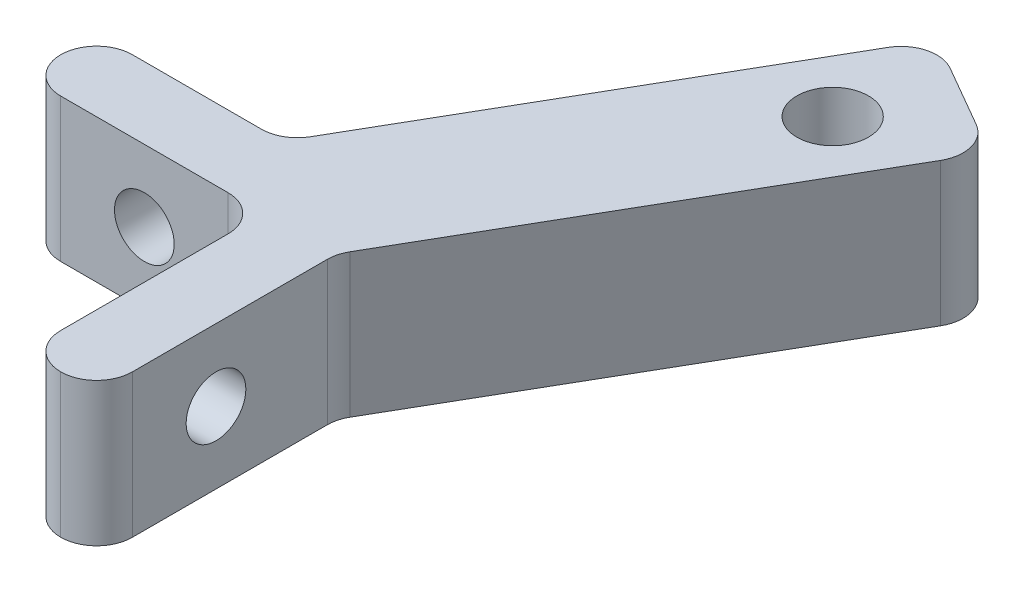
ISO-10303-21;
HEADER;
FILE_DESCRIPTION(('STEP AP214'),'2;1');
FILE_NAME('part.step','',(''),(''),'','','');
FILE_SCHEMA(('AUTOMOTIVE_DESIGN { 1 0 10303 214 1 1 1 1 }'));
ENDSEC;
DATA;
#1=APPLICATION_CONTEXT('core data for automotive mechanical design processes');
#2=APPLICATION_PROTOCOL_DEFINITION('international standard','automotive_design',2000,#1);
#3=PRODUCT_CONTEXT('',#1,'mechanical');
#4=PRODUCT('Part','Part','',(#3));
#5=PRODUCT_RELATED_PRODUCT_CATEGORY('part','',(#4));
#6=PRODUCT_DEFINITION_FORMATION('','',#4);
#7=PRODUCT_DEFINITION_CONTEXT('part definition',#1,'design');
#8=PRODUCT_DEFINITION('design','',#6,#7);
#9=PRODUCT_DEFINITION_SHAPE('','',#8);
#10=(LENGTH_UNIT() NAMED_UNIT(*) SI_UNIT(.MILLI.,.METRE.));
#11=(NAMED_UNIT(*) PLANE_ANGLE_UNIT() SI_UNIT($,.RADIAN.));
#12=(NAMED_UNIT(*) SI_UNIT($,.STERADIAN.) SOLID_ANGLE_UNIT());
#13=UNCERTAINTY_MEASURE_WITH_UNIT(LENGTH_MEASURE(1.E-05),#10,'distance_accuracy_value','');
#14=(GEOMETRIC_REPRESENTATION_CONTEXT(3) GLOBAL_UNCERTAINTY_ASSIGNED_CONTEXT((#13)) GLOBAL_UNIT_ASSIGNED_CONTEXT((#10,
#11,#12)) REPRESENTATION_CONTEXT('',''));
#15=CARTESIAN_POINT('',(0.,0.,0.));
#16=DIRECTION('',(0.,0.,1.));
#17=DIRECTION('',(1.,0.,0.));
#18=AXIS2_PLACEMENT_3D('',#15,#16,#17);
#19=CARTESIAN_POINT('',(20.0710721887332,-6.,-34.7641167932687));
#20=DIRECTION('',(-0.86602540378444,0.,-0.499999999999998));
#21=DIRECTION('',(-0.499999999999998,0.,0.86602540378444));
#22=AXIS2_PLACEMENT_3D('',#19,#20,#21);
#23=PLANE('',#22);
#24=DIRECTION('',(-0.500000000000004,0.,0.866025403784436));
#25=VECTOR('',#24,1.);
#26=CARTESIAN_POINT('',(2.63202289441557,-6.,-4.55879737981221));
#27=LINE('',#26,#25);
#28=CARTESIAN_POINT('',(18.5710721887335,-6.,-32.1660405819153));
#29=VERTEX_POINT('',#28);
#30=CARTESIAN_POINT('',(0.866025403784463,-6.,-1.50000000000003));
#31=VERTEX_POINT('',#30);
#32=EDGE_CURVE('E295',#29,#31,#27,.T.);
#33=ORIENTED_EDGE('',*,*,#32,.T.);
#34=DIRECTION('',(0.,1.,0.));
#35=VECTOR('',#34,1.);
#36=CARTESIAN_POINT('',(0.866025403784489,6.,-1.50000000000001));
#37=LINE('',#36,#35);
#38=CARTESIAN_POINT('',(0.866025403784463,6.,-1.50000000000003));
#39=VERTEX_POINT('',#38);
#40=EDGE_CURVE('E182',#31,#39,#37,.T.);
#41=ORIENTED_EDGE('',*,*,#40,.T.);
#42=DIRECTION('',(-0.500000000000004,0.,0.866025403784436));
#43=VECTOR('',#42,1.);
#44=CARTESIAN_POINT('',(2.63202289441557,6.,-4.55879737981221));
#45=LINE('',#44,#43);
#46=CARTESIAN_POINT('',(18.5710721887335,6.,-32.1660405819153));
#47=VERTEX_POINT('',#46);
#48=EDGE_CURVE('E165',#47,#39,#45,.T.);
#49=ORIENTED_EDGE('',*,*,#48,.F.);
#50=DIRECTION('',(0.,1.,0.));
#51=VECTOR('',#50,1.);
#52=CARTESIAN_POINT('',(18.5710721887333,-6.,-32.1660405819155));
#53=LINE('',#52,#51);
#54=EDGE_CURVE('E179',#47,#29,#53,.F.);
#55=ORIENTED_EDGE('',*,*,#54,.T.);
#56=EDGE_LOOP('',(#33,#41,#49,#55));
#57=FACE_BOUND('',#56,.T.);
#58=ADVANCED_FACE('F38',(#57),#23,.T.);
#59=CARTESIAN_POINT('',(30.4633770341466,-6.,-28.7641167932689));
#60=DIRECTION('',(0.499999999999984,0.,-0.866025403784448));
#61=DIRECTION('',(-0.866025403784448,0.,-0.499999999999984));
#62=AXIS2_PLACEMENT_3D('',#59,#60,#61);
#63=PLANE('',#62);
#64=DIRECTION('',(-0.866025403784448,0.,-0.499999999999984));
#65=VECTOR('',#64,1.);
#66=CARTESIAN_POINT('',(30.4633770341466,6.,-28.7641167932689));
#67=LINE('',#66,#65);
#68=CARTESIAN_POINT('',(27.8653008227932,6.,-30.2641167932689));
#69=VERTEX_POINT('',#68);
#70=CARTESIAN_POINT('',(22.6691484000865,6.,-33.2641167932688));
#71=VERTEX_POINT('',#70);
#72=EDGE_CURVE('E167',#69,#71,#67,.T.);
#73=ORIENTED_EDGE('',*,*,#72,.F.);
#74=DIRECTION('',(0.,1.,0.));
#75=VECTOR('',#74,1.);
#76=CARTESIAN_POINT('',(27.8653008227932,-6.,-30.2641167932689));
#77=LINE('',#76,#75);
#78=CARTESIAN_POINT('',(27.8653008227932,-6.,-30.2641167932689));
#79=VERTEX_POINT('',#78);
#80=EDGE_CURVE('E253',#69,#79,#77,.F.);
#81=ORIENTED_EDGE('',*,*,#80,.T.);
#82=DIRECTION('',(-0.866025403784448,0.,-0.499999999999984));
#83=VECTOR('',#82,1.);
#84=CARTESIAN_POINT('',(30.4633770341466,-6.,-28.7641167932689));
#85=LINE('',#84,#83);
#86=CARTESIAN_POINT('',(22.6691484000865,-6.,-33.2641167932688));
#87=VERTEX_POINT('',#86);
#88=EDGE_CURVE('E190',#79,#87,#85,.T.);
#89=ORIENTED_EDGE('',*,*,#88,.T.);
#90=DIRECTION('',(0.,1.,0.));
#91=VECTOR('',#90,1.);
#92=CARTESIAN_POINT('',(22.6691484000865,-6.,-33.2641167932688));
#93=LINE('',#92,#91);
#94=EDGE_CURVE('E251',#87,#71,#93,.T.);
#95=ORIENTED_EDGE('',*,*,#94,.T.);
#96=EDGE_LOOP('',(#73,#81,#89,#95));
#97=FACE_BOUND('',#96,.T.);
#98=ADVANCED_FACE('F324',(#97),#63,.T.);
#99=CARTESIAN_POINT('',(10.463377034147,-6.,5.87689935810887));
#100=DIRECTION('',(0.866025403784445,0.,0.499999999999989));
#101=DIRECTION('',(0.499999999999989,0.,-0.866025403784445));
#102=AXIS2_PLACEMENT_3D('',#99,#100,#101);
#103=PLANE('',#102);
#104=DIRECTION('',(0.499999999999989,0.,-0.866025403784445));
#105=VECTOR('',#104,1.);
#106=CARTESIAN_POINT('',(10.463377034147,6.,5.87689935810887));
#107=LINE('',#106,#105);
#108=CARTESIAN_POINT('',(10.8653008227937,6.,5.18074693540225));
#109=VERTEX_POINT('',#108);
#110=CARTESIAN_POINT('',(28.9633770341466,6.,-26.1660405819156));
#111=VERTEX_POINT('',#110);
#112=EDGE_CURVE('E322',#109,#111,#107,.T.);
#113=ORIENTED_EDGE('',*,*,#112,.F.);
#114=DIRECTION('',(0.,1.,0.));
#115=VECTOR('',#114,1.);
#116=CARTESIAN_POINT('',(10.8653008227937,-6.,5.18074693540225));
#117=LINE('',#116,#115);
#118=CARTESIAN_POINT('',(10.8653008227937,-6.,5.18074693540225));
#119=VERTEX_POINT('',#118);
#120=EDGE_CURVE('E249',#109,#119,#117,.F.);
#121=ORIENTED_EDGE('',*,*,#120,.T.);
#122=DIRECTION('',(0.499999999999989,0.,-0.866025403784445));
#123=VECTOR('',#122,1.);
#124=CARTESIAN_POINT('',(10.463377034147,-6.,5.87689935810887));
#125=LINE('',#124,#123);
#126=CARTESIAN_POINT('',(28.9633770341466,-6.,-26.1660405819156));
#127=VERTEX_POINT('',#126);
#128=EDGE_CURVE('E197',#119,#127,#125,.T.);
#129=ORIENTED_EDGE('',*,*,#128,.T.);
#130=DIRECTION('',(0.,1.,0.));
#131=VECTOR('',#130,1.);
#132=CARTESIAN_POINT('',(28.9633770341466,-6.,-26.1660405819156));
#133=LINE('',#132,#131);
#134=EDGE_CURVE('E245',#127,#111,#133,.T.);
#135=ORIENTED_EDGE('',*,*,#134,.T.);
#136=EDGE_LOOP('',(#113,#121,#129,#135));
#137=FACE_BOUND('',#136,.T.);
#138=ADVANCED_FACE('F314',(#137),#103,.T.);
#139=CARTESIAN_POINT('',(10.463377034147,-6.,26.));
#140=DIRECTION('',(1.,0.,0.));
#141=DIRECTION('',(0.,0.,-1.));
#142=AXIS2_PLACEMENT_3D('',#139,#140,#141);
#143=PLANE('',#142);
#144=CARTESIAN_POINT('',(10.463377034147,0.,16.));
#145=DIRECTION('',(1.,0.,0.));
#146=DIRECTION('',(0.,0.,-1.));
#147=AXIS2_PLACEMENT_3D('',#144,#145,#146);
#148=CIRCLE('',#147,2.5);
#149=CARTESIAN_POINT('',(10.463377034147,0.,13.5));
#150=VERTEX_POINT('',#149);
#151=EDGE_CURVE('E347',#150,#150,#148,.T.);
#152=ORIENTED_EDGE('',*,*,#151,.F.);
#153=EDGE_LOOP('',(#152));
#154=FACE_BOUND('',#153,.T.);
#155=DIRECTION('',(0.,0.,-1.));
#156=VECTOR('',#155,1.);
#157=CARTESIAN_POINT('',(10.463377034147,6.,26.));
#158=LINE('',#157,#156);
#159=CARTESIAN_POINT('',(10.463377034147,6.,23.));
#160=VERTEX_POINT('',#159);
#161=CARTESIAN_POINT('',(10.463377034147,6.,6.68074693540221));
#162=VERTEX_POINT('',#161);
#163=EDGE_CURVE('E331',#160,#162,#158,.T.);
#164=ORIENTED_EDGE('',*,*,#163,.F.);
#165=DIRECTION('',(0.,1.,0.));
#166=VECTOR('',#165,1.);
#167=CARTESIAN_POINT('',(10.463377034147,-6.,23.));
#168=LINE('',#167,#166);
#169=CARTESIAN_POINT('',(10.463377034147,-6.,23.));
#170=VERTEX_POINT('',#169);
#171=EDGE_CURVE('E219',#160,#170,#168,.F.);
#172=ORIENTED_EDGE('',*,*,#171,.T.);
#173=DIRECTION('',(0.,0.,-1.));
#174=VECTOR('',#173,1.);
#175=CARTESIAN_POINT('',(10.463377034147,-6.,26.));
#176=LINE('',#175,#174);
#177=CARTESIAN_POINT('',(10.463377034147,-6.,6.68074693540221));
#178=VERTEX_POINT('',#177);
#179=EDGE_CURVE('E305',#170,#178,#176,.T.);
#180=ORIENTED_EDGE('',*,*,#179,.T.);
#181=DIRECTION('',(0.,1.,0.));
#182=VECTOR('',#181,1.);
#183=CARTESIAN_POINT('',(10.463377034147,6.,6.68074693540221));
#184=LINE('',#183,#182);
#185=EDGE_CURVE('E216',#178,#162,#184,.T.);
#186=ORIENTED_EDGE('',*,*,#185,.T.);
#187=EDGE_LOOP('',(#164,#172,#180,#186));
#188=FACE_BOUND('',#187,.T.);
#189=ADVANCED_FACE('F384',(#154,#188),#143,.T.);
#190=CARTESIAN_POINT('',(4.46337703414703,-6.,6.));
#191=DIRECTION('',(-1.,0.,0.));
#192=DIRECTION('',(0.,0.,1.));
#193=AXIS2_PLACEMENT_3D('',#190,#191,#192);
#194=PLANE('',#193);
#195=CARTESIAN_POINT('',(4.46337703414703,0.,16.));
#196=DIRECTION('',(-1.,0.,0.));
#197=DIRECTION('',(0.,0.,1.));
#198=AXIS2_PLACEMENT_3D('',#195,#196,#197);
#199=CIRCLE('',#198,2.5);
#200=CARTESIAN_POINT('',(4.46337703414703,0.,18.5));
#201=VERTEX_POINT('',#200);
#202=EDGE_CURVE('E350',#201,#201,#199,.T.);
#203=ORIENTED_EDGE('',*,*,#202,.F.);
#204=EDGE_LOOP('',(#203));
#205=FACE_BOUND('',#204,.T.);
#206=DIRECTION('',(0.,0.,1.));
#207=VECTOR('',#206,1.);
#208=CARTESIAN_POINT('',(4.46337703414703,-6.,6.));
#209=LINE('',#208,#207);
#210=CARTESIAN_POINT('',(4.46337703414703,-6.,9.));
#211=VERTEX_POINT('',#210);
#212=CARTESIAN_POINT('',(4.46337703414703,-6.,23.));
#213=VERTEX_POINT('',#212);
#214=EDGE_CURVE('E297',#211,#213,#209,.T.);
#215=ORIENTED_EDGE('',*,*,#214,.T.);
#216=DIRECTION('',(0.,1.,0.));
#217=VECTOR('',#216,1.);
#218=CARTESIAN_POINT('',(4.46337703414703,-6.,23.));
#219=LINE('',#218,#217);
#220=CARTESIAN_POINT('',(4.46337703414703,6.,23.));
#221=VERTEX_POINT('',#220);
#222=EDGE_CURVE('E236',#213,#221,#219,.T.);
#223=ORIENTED_EDGE('',*,*,#222,.T.);
#224=DIRECTION('',(0.,0.,1.));
#225=VECTOR('',#224,1.);
#226=CARTESIAN_POINT('',(4.46337703414703,6.,6.));
#227=LINE('',#226,#225);
#228=CARTESIAN_POINT('',(4.46337703414703,6.,9.));
#229=VERTEX_POINT('',#228);
#230=EDGE_CURVE('E336',#229,#221,#227,.T.);
#231=ORIENTED_EDGE('',*,*,#230,.F.);
#232=DIRECTION('',(0.,1.,0.));
#233=VECTOR('',#232,1.);
#234=CARTESIAN_POINT('',(4.46337703414703,-6.,9.));
#235=LINE('',#234,#233);
#236=EDGE_CURVE('E234',#229,#211,#235,.F.);
#237=ORIENTED_EDGE('',*,*,#236,.T.);
#238=EDGE_LOOP('',(#215,#223,#231,#237));
#239=FACE_BOUND('',#238,.T.);
#240=ADVANCED_FACE('F370',(#205,#239),#194,.T.);
#241=CARTESIAN_POINT('',(-15.536622965853,-6.,6.));
#242=DIRECTION('',(0.,0.,1.));
#243=DIRECTION('',(1.,0.,0.));
#244=AXIS2_PLACEMENT_3D('',#241,#242,#243);
#245=PLANE('',#244);
#246=CARTESIAN_POINT('',(-5.53662296585297,0.,6.));
#247=DIRECTION('',(0.,0.,1.));
#248=DIRECTION('',(1.,0.,0.));
#249=AXIS2_PLACEMENT_3D('',#246,#247,#248);
#250=CIRCLE('',#249,2.5);
#251=CARTESIAN_POINT('',(-3.03662296585297,0.,6.));
#252=VERTEX_POINT('',#251);
#253=EDGE_CURVE('E266',#252,#252,#250,.T.);
#254=ORIENTED_EDGE('',*,*,#253,.F.);
#255=EDGE_LOOP('',(#254));
#256=FACE_BOUND('',#255,.T.);
#257=DIRECTION('',(1.,0.,0.));
#258=VECTOR('',#257,1.);
#259=CARTESIAN_POINT('',(-15.536622965853,6.,6.));
#260=LINE('',#259,#258);
#261=CARTESIAN_POINT('',(-12.536622965853,6.,6.));
#262=VERTEX_POINT('',#261);
#263=CARTESIAN_POINT('',(1.46337703414703,6.,6.));
#264=VERTEX_POINT('',#263);
#265=EDGE_CURVE('E340',#262,#264,#260,.T.);
#266=ORIENTED_EDGE('',*,*,#265,.F.);
#267=DIRECTION('',(0.,1.,0.));
#268=VECTOR('',#267,1.);
#269=CARTESIAN_POINT('',(-12.536622965853,-6.,6.));
#270=LINE('',#269,#268);
#271=CARTESIAN_POINT('',(-12.536622965853,-6.,6.));
#272=VERTEX_POINT('',#271);
#273=EDGE_CURVE('E242',#262,#272,#270,.F.);
#274=ORIENTED_EDGE('',*,*,#273,.T.);
#275=DIRECTION('',(1.,0.,0.));
#276=VECTOR('',#275,1.);
#277=CARTESIAN_POINT('',(-15.536622965853,-6.,6.));
#278=LINE('',#277,#276);
#279=CARTESIAN_POINT('',(1.46337703414703,-6.,6.));
#280=VERTEX_POINT('',#279);
#281=EDGE_CURVE('E294',#272,#280,#278,.T.);
#282=ORIENTED_EDGE('',*,*,#281,.T.);
#283=DIRECTION('',(0.,1.,0.));
#284=VECTOR('',#283,1.);
#285=CARTESIAN_POINT('',(1.46337703414703,6.,6.));
#286=LINE('',#285,#284);
#287=EDGE_CURVE('E239',#280,#264,#286,.T.);
#288=ORIENTED_EDGE('',*,*,#287,.T.);
#289=EDGE_LOOP('',(#266,#274,#282,#288));
#290=FACE_BOUND('',#289,.T.);
#291=ADVANCED_FACE('F361',(#256,#290),#245,.T.);
#292=CARTESIAN_POINT('',(0.,-6.,0.));
#293=DIRECTION('',(0.,0.,-1.));
#294=DIRECTION('',(-1.,0.,0.));
#295=AXIS2_PLACEMENT_3D('',#292,#293,#294);
#296=PLANE('',#295);
#297=CARTESIAN_POINT('',(-5.53662296585297,0.,0.));
#298=DIRECTION('',(0.,0.,-1.));
#299=DIRECTION('',(-1.,0.,0.));
#300=AXIS2_PLACEMENT_3D('',#297,#298,#299);
#301=CIRCLE('',#300,2.5);
#302=CARTESIAN_POINT('',(-8.03662296585297,0.,0.));
#303=VERTEX_POINT('',#302);
#304=EDGE_CURVE('E200',#303,#303,#301,.T.);
#305=ORIENTED_EDGE('',*,*,#304,.F.);
#306=EDGE_LOOP('',(#305));
#307=FACE_BOUND('',#306,.T.);
#308=DIRECTION('',(-1.,0.,0.));
#309=VECTOR('',#308,1.);
#310=CARTESIAN_POINT('',(0.,6.,0.));
#311=LINE('',#310,#309);
#312=CARTESIAN_POINT('',(-1.73205080756883,6.,0.));
#313=VERTEX_POINT('',#312);
#314=CARTESIAN_POINT('',(-12.536622965853,6.,0.));
#315=VERTEX_POINT('',#314);
#316=EDGE_CURVE('E184',#313,#315,#311,.T.);
#317=ORIENTED_EDGE('',*,*,#316,.F.);
#318=DIRECTION('',(0.,1.,0.));
#319=VECTOR('',#318,1.);
#320=CARTESIAN_POINT('',(-1.73205080756883,-6.,0.));
#321=LINE('',#320,#319);
#322=CARTESIAN_POINT('',(-1.73205080756883,-6.,0.));
#323=VERTEX_POINT('',#322);
#324=EDGE_CURVE('E174',#313,#323,#321,.F.);
#325=ORIENTED_EDGE('',*,*,#324,.T.);
#326=DIRECTION('',(-1.,0.,0.));
#327=VECTOR('',#326,1.);
#328=CARTESIAN_POINT('',(0.,-6.,0.));
#329=LINE('',#328,#327);
#330=CARTESIAN_POINT('',(-12.536622965853,-6.,0.));
#331=VERTEX_POINT('',#330);
#332=EDGE_CURVE('E287',#323,#331,#329,.T.);
#333=ORIENTED_EDGE('',*,*,#332,.T.);
#334=DIRECTION('',(0.,1.,0.));
#335=VECTOR('',#334,1.);
#336=CARTESIAN_POINT('',(-12.536622965853,-6.,0.));
#337=LINE('',#336,#335);
#338=EDGE_CURVE('E193',#331,#315,#337,.T.);
#339=ORIENTED_EDGE('',*,*,#338,.T.);
#340=EDGE_LOOP('',(#317,#325,#333,#339));
#341=FACE_BOUND('',#340,.T.);
#342=ADVANCED_FACE('F291',(#307,#341),#296,.T.);
#343=CARTESIAN_POINT('',(0.,-6.,0.));
#344=DIRECTION('',(0.,-1.,0.));
#345=DIRECTION('',(0.,0.,-1.));
#346=AXIS2_PLACEMENT_3D('',#343,#344,#345);
#347=PLANE('',#346);
#348=CARTESIAN_POINT('',(21.26722461144,-6.,-24.8359135629934));
#349=DIRECTION('',(0.,1.,0.));
#350=DIRECTION('',(0.,0.,1.));
#351=AXIS2_PLACEMENT_3D('',#348,#349,#350);
#352=CIRCLE('',#351,2.99999999999997);
#353=CARTESIAN_POINT('',(21.26722461144,-6.,-21.8359135629934));
#354=VERTEX_POINT('',#353);
#355=EDGE_CURVE('E299',#354,#354,#352,.T.);
#356=ORIENTED_EDGE('',*,*,#355,.T.);
#357=EDGE_LOOP('',(#356));
#358=FACE_BOUND('',#357,.T.);
#359=ORIENTED_EDGE('',*,*,#179,.F.);
#360=CARTESIAN_POINT('',(7.46337703414704,-6.,23.));
#361=DIRECTION('',(0.,-1.,0.));
#362=DIRECTION('',(0.,0.,-1.));
#363=AXIS2_PLACEMENT_3D('',#360,#361,#362);
#364=CIRCLE('',#363,3.);
#365=CARTESIAN_POINT('',(7.46337703414703,-6.,26.));
#366=VERTEX_POINT('',#365);
#367=EDGE_CURVE('E232',#170,#366,#364,.T.);
#368=ORIENTED_EDGE('',*,*,#367,.T.);
#369=CARTESIAN_POINT('',(7.46337703414703,-6.,23.));
#370=DIRECTION('',(0.,-1.,0.));
#371=DIRECTION('',(0.,0.,-1.));
#372=AXIS2_PLACEMENT_3D('',#369,#370,#371);
#373=CIRCLE('',#372,3.);
#374=EDGE_CURVE('E230',#366,#213,#373,.T.);
#375=ORIENTED_EDGE('',*,*,#374,.T.);
#376=ORIENTED_EDGE('',*,*,#214,.F.);
#377=CARTESIAN_POINT('',(1.46337703414703,-6.,9.));
#378=DIRECTION('',(0.,-1.,0.));
#379=DIRECTION('',(0.,0.,-1.));
#380=AXIS2_PLACEMENT_3D('',#377,#378,#379);
#381=CIRCLE('',#380,3.);
#382=EDGE_CURVE('E61',#211,#280,#381,.F.);
#383=ORIENTED_EDGE('',*,*,#382,.T.);
#384=ORIENTED_EDGE('',*,*,#281,.F.);
#385=CARTESIAN_POINT('',(-12.536622965853,-6.,3.));
#386=DIRECTION('',(0.,-1.,0.));
#387=DIRECTION('',(0.,0.,-1.));
#388=AXIS2_PLACEMENT_3D('',#385,#386,#387);
#389=CIRCLE('',#388,3.);
#390=CARTESIAN_POINT('',(-15.536622965853,-6.,3.));
#391=VERTEX_POINT('',#390);
#392=EDGE_CURVE('E55',#272,#391,#389,.T.);
#393=ORIENTED_EDGE('',*,*,#392,.T.);
#394=CARTESIAN_POINT('',(-12.536622965853,-6.,3.));
#395=DIRECTION('',(0.,-1.,0.));
#396=DIRECTION('',(0.,0.,-1.));
#397=AXIS2_PLACEMENT_3D('',#394,#395,#396);
#398=CIRCLE('',#397,3.);
#399=EDGE_CURVE('E227',#391,#331,#398,.T.);
#400=ORIENTED_EDGE('',*,*,#399,.T.);
#401=ORIENTED_EDGE('',*,*,#332,.F.);
#402=CARTESIAN_POINT('',(-1.73205080756883,-6.,-3.));
#403=DIRECTION('',(0.,-1.,0.));
#404=DIRECTION('',(0.,0.,-1.));
#405=AXIS2_PLACEMENT_3D('',#402,#403,#404);
#406=CIRCLE('',#405,3.);
#407=EDGE_CURVE('E258',#323,#31,#406,.F.);
#408=ORIENTED_EDGE('',*,*,#407,.T.);
#409=ORIENTED_EDGE('',*,*,#32,.F.);
#410=CARTESIAN_POINT('',(21.1691484000866,-6.,-30.6660405819155));
#411=DIRECTION('',(0.,-1.,0.));
#412=DIRECTION('',(0.,0.,-1.));
#413=AXIS2_PLACEMENT_3D('',#410,#411,#412);
#414=CIRCLE('',#413,3.);
#415=EDGE_CURVE('E188',#29,#87,#414,.T.);
#416=ORIENTED_EDGE('',*,*,#415,.T.);
#417=ORIENTED_EDGE('',*,*,#88,.F.);
#418=CARTESIAN_POINT('',(26.3653008227933,-6.,-27.6660405819156));
#419=DIRECTION('',(0.,-1.,0.));
#420=DIRECTION('',(0.,0.,-1.));
#421=AXIS2_PLACEMENT_3D('',#418,#419,#420);
#422=CIRCLE('',#421,3.);
#423=EDGE_CURVE('E224',#79,#127,#422,.T.);
#424=ORIENTED_EDGE('',*,*,#423,.T.);
#425=ORIENTED_EDGE('',*,*,#128,.F.);
#426=CARTESIAN_POINT('',(13.4633770341471,-6.,6.68074693540222));
#427=DIRECTION('',(0.,-1.,0.));
#428=DIRECTION('',(0.,0.,-1.));
#429=AXIS2_PLACEMENT_3D('',#426,#427,#428);
#430=CIRCLE('',#429,3.);
#431=EDGE_CURVE('E11',#119,#178,#430,.F.);
#432=ORIENTED_EDGE('',*,*,#431,.T.);
#433=EDGE_LOOP('',(#359,#368,#375,#376,#383,#384,#393,#400,#401,#408,#409,#416,#417,#424,#425,#432));
#434=FACE_BOUND('',#433,.T.);
#435=ADVANCED_FACE('F286',(#358,#434),#347,.T.);
#436=CARTESIAN_POINT('',(21.26722461144,-6.,-24.8359135629934));
#437=DIRECTION('',(0.,1.,0.));
#438=DIRECTION('',(0.,0.,1.));
#439=AXIS2_PLACEMENT_3D('',#436,#437,#438);
#440=CYLINDRICAL_SURFACE('',#439,2.99999999999997);
#441=ORIENTED_EDGE('',*,*,#355,.F.);
#442=EDGE_LOOP('',(#441));
#443=FACE_BOUND('',#442,.T.);
#444=CARTESIAN_POINT('',(21.26722461144,6.,-24.8359135629934));
#445=DIRECTION('',(0.,1.,0.));
#446=DIRECTION('',(0.,0.,1.));
#447=AXIS2_PLACEMENT_3D('',#444,#445,#446);
#448=CIRCLE('',#447,2.99999999999997);
#449=CARTESIAN_POINT('',(21.26722461144,6.,-21.8359135629934));
#450=VERTEX_POINT('',#449);
#451=EDGE_CURVE('E185',#450,#450,#448,.T.);
#452=ORIENTED_EDGE('',*,*,#451,.T.);
#453=EDGE_LOOP('',(#452));
#454=FACE_BOUND('',#453,.T.);
#455=ADVANCED_FACE('F367',(#443,#454),#440,.F.);
#456=CARTESIAN_POINT('',(0.,6.,0.));
#457=DIRECTION('',(0.,-1.,0.));
#458=DIRECTION('',(0.,0.,-1.));
#459=AXIS2_PLACEMENT_3D('',#456,#457,#458);
#460=PLANE('',#459);
#461=CARTESIAN_POINT('',(7.46337703414703,6.,23.));
#462=DIRECTION('',(0.,-1.,0.));
#463=DIRECTION('',(0.,0.,-1.));
#464=AXIS2_PLACEMENT_3D('',#461,#462,#463);
#465=CIRCLE('',#464,3.);
#466=CARTESIAN_POINT('',(7.46337703414703,6.,26.));
#467=VERTEX_POINT('',#466);
#468=EDGE_CURVE('E210',#221,#467,#465,.F.);
#469=ORIENTED_EDGE('',*,*,#468,.T.);
#470=CARTESIAN_POINT('',(7.46337703414704,6.,23.));
#471=DIRECTION('',(0.,-1.,0.));
#472=DIRECTION('',(0.,0.,-1.));
#473=AXIS2_PLACEMENT_3D('',#470,#471,#472);
#474=CIRCLE('',#473,3.);
#475=EDGE_CURVE('E213',#467,#160,#474,.F.);
#476=ORIENTED_EDGE('',*,*,#475,.T.);
#477=ORIENTED_EDGE('',*,*,#163,.T.);
#478=CARTESIAN_POINT('',(13.4633770341471,6.,6.68074693540222));
#479=DIRECTION('',(0.,-1.,0.));
#480=DIRECTION('',(0.,0.,-1.));
#481=AXIS2_PLACEMENT_3D('',#478,#479,#480);
#482=CIRCLE('',#481,3.);
#483=EDGE_CURVE('E47',#162,#109,#482,.T.);
#484=ORIENTED_EDGE('',*,*,#483,.T.);
#485=ORIENTED_EDGE('',*,*,#112,.T.);
#486=CARTESIAN_POINT('',(26.3653008227933,6.,-27.6660405819156));
#487=DIRECTION('',(0.,-1.,0.));
#488=DIRECTION('',(0.,0.,-1.));
#489=AXIS2_PLACEMENT_3D('',#486,#487,#488);
#490=CIRCLE('',#489,3.);
#491=EDGE_CURVE('E173',#111,#69,#490,.F.);
#492=ORIENTED_EDGE('',*,*,#491,.T.);
#493=ORIENTED_EDGE('',*,*,#72,.T.);
#494=CARTESIAN_POINT('',(21.1691484000866,6.,-30.6660405819155));
#495=DIRECTION('',(0.,-1.,0.));
#496=DIRECTION('',(0.,0.,-1.));
#497=AXIS2_PLACEMENT_3D('',#494,#495,#496);
#498=CIRCLE('',#497,3.);
#499=EDGE_CURVE('E161',#71,#47,#498,.F.);
#500=ORIENTED_EDGE('',*,*,#499,.T.);
#501=ORIENTED_EDGE('',*,*,#48,.T.);
#502=CARTESIAN_POINT('',(-1.73205080756883,6.,-3.));
#503=DIRECTION('',(0.,-1.,0.));
#504=DIRECTION('',(0.,0.,-1.));
#505=AXIS2_PLACEMENT_3D('',#502,#503,#504);
#506=CIRCLE('',#505,3.);
#507=EDGE_CURVE('E256',#39,#313,#506,.T.);
#508=ORIENTED_EDGE('',*,*,#507,.T.);
#509=ORIENTED_EDGE('',*,*,#316,.T.);
#510=CARTESIAN_POINT('',(-12.536622965853,6.,3.));
#511=DIRECTION('',(0.,-1.,0.));
#512=DIRECTION('',(0.,0.,-1.));
#513=AXIS2_PLACEMENT_3D('',#510,#511,#512);
#514=CIRCLE('',#513,3.);
#515=CARTESIAN_POINT('',(-15.536622965853,6.,3.));
#516=VERTEX_POINT('',#515);
#517=EDGE_CURVE('E206',#315,#516,#514,.F.);
#518=ORIENTED_EDGE('',*,*,#517,.T.);
#519=CARTESIAN_POINT('',(-12.536622965853,6.,3.));
#520=DIRECTION('',(0.,-1.,0.));
#521=DIRECTION('',(0.,0.,-1.));
#522=AXIS2_PLACEMENT_3D('',#519,#520,#521);
#523=CIRCLE('',#522,3.);
#524=EDGE_CURVE('E208',#516,#262,#523,.F.);
#525=ORIENTED_EDGE('',*,*,#524,.T.);
#526=ORIENTED_EDGE('',*,*,#265,.T.);
#527=CARTESIAN_POINT('',(1.46337703414703,6.,9.));
#528=DIRECTION('',(0.,-1.,0.));
#529=DIRECTION('',(0.,0.,-1.));
#530=AXIS2_PLACEMENT_3D('',#527,#528,#529);
#531=CIRCLE('',#530,3.);
#532=EDGE_CURVE('E260',#264,#229,#531,.T.);
#533=ORIENTED_EDGE('',*,*,#532,.T.);
#534=ORIENTED_EDGE('',*,*,#230,.T.);
#535=EDGE_LOOP('',(#469,#476,#477,#484,#485,#492,#493,#500,#501,#508,#509,#518,#525,#526,#533,#534));
#536=FACE_BOUND('',#535,.T.);
#537=ORIENTED_EDGE('',*,*,#451,.F.);
#538=EDGE_LOOP('',(#537));
#539=FACE_BOUND('',#538,.T.);
#540=ADVANCED_FACE('F163',(#536,#539),#460,.F.);
#541=CARTESIAN_POINT('',(30.4633770341466,0.,16.));
#542=DIRECTION('',(-1.,0.,0.));
#543=DIRECTION('',(0.,0.,1.));
#544=AXIS2_PLACEMENT_3D('',#541,#542,#543);
#545=CYLINDRICAL_SURFACE('',#544,2.5);
#546=ORIENTED_EDGE('',*,*,#151,.T.);
#547=EDGE_LOOP('',(#546));
#548=FACE_BOUND('',#547,.T.);
#549=ORIENTED_EDGE('',*,*,#202,.T.);
#550=EDGE_LOOP('',(#549));
#551=FACE_BOUND('',#550,.T.);
#552=ADVANCED_FACE('F415',(#548,#551),#545,.F.);
#553=CARTESIAN_POINT('',(-5.53662296585297,0.,-34.7641167932687));
#554=DIRECTION('',(0.,0.,1.));
#555=DIRECTION('',(1.,0.,0.));
#556=AXIS2_PLACEMENT_3D('',#553,#554,#555);
#557=CYLINDRICAL_SURFACE('',#556,2.5);
#558=ORIENTED_EDGE('',*,*,#304,.T.);
#559=EDGE_LOOP('',(#558));
#560=FACE_BOUND('',#559,.T.);
#561=ORIENTED_EDGE('',*,*,#253,.T.);
#562=EDGE_LOOP('',(#561));
#563=FACE_BOUND('',#562,.T.);
#564=ADVANCED_FACE('F357',(#560,#563),#557,.F.);
#565=CARTESIAN_POINT('',(-1.73205080756883,-6.,-3.));
#566=DIRECTION('',(0.,-1.,0.));
#567=DIRECTION('',(0.,0.,-1.));
#568=AXIS2_PLACEMENT_3D('',#565,#566,#567);
#569=CYLINDRICAL_SURFACE('',#568,3.);
#570=ORIENTED_EDGE('',*,*,#407,.F.);
#571=ORIENTED_EDGE('',*,*,#324,.F.);
#572=ORIENTED_EDGE('',*,*,#507,.F.);
#573=ORIENTED_EDGE('',*,*,#40,.F.);
#574=EDGE_LOOP('',(#570,#571,#572,#573));
#575=FACE_BOUND('',#574,.T.);
#576=ADVANCED_FACE('F407',(#575),#569,.F.);
#577=CARTESIAN_POINT('',(7.46337703414703,-6.,23.));
#578=DIRECTION('',(0.,1.,0.));
#579=DIRECTION('',(0.,0.,1.));
#580=AXIS2_PLACEMENT_3D('',#577,#578,#579);
#581=CYLINDRICAL_SURFACE('',#580,3.);
#582=ORIENTED_EDGE('',*,*,#222,.F.);
#583=ORIENTED_EDGE('',*,*,#374,.F.);
#584=DIRECTION('',(0.,1.,0.));
#585=VECTOR('',#584,1.);
#586=CARTESIAN_POINT('',(7.46337703414703,-6.,26.));
#587=LINE('',#586,#585);
#588=EDGE_CURVE('E263',#467,#366,#587,.F.);
#589=ORIENTED_EDGE('',*,*,#588,.F.);
#590=ORIENTED_EDGE('',*,*,#468,.F.);
#591=EDGE_LOOP('',(#582,#583,#589,#590));
#592=FACE_BOUND('',#591,.T.);
#593=ADVANCED_FACE('F399',(#592),#581,.T.);
#594=CARTESIAN_POINT('',(7.46337703414704,-6.,23.));
#595=DIRECTION('',(0.,1.,0.));
#596=DIRECTION('',(0.,0.,1.));
#597=AXIS2_PLACEMENT_3D('',#594,#595,#596);
#598=CYLINDRICAL_SURFACE('',#597,3.);
#599=ORIENTED_EDGE('',*,*,#367,.F.);
#600=ORIENTED_EDGE('',*,*,#171,.F.);
#601=ORIENTED_EDGE('',*,*,#475,.F.);
#602=ORIENTED_EDGE('',*,*,#588,.T.);
#603=EDGE_LOOP('',(#599,#600,#601,#602));
#604=FACE_BOUND('',#603,.T.);
#605=ADVANCED_FACE('F413',(#604),#598,.T.);
#606=CARTESIAN_POINT('',(-12.536622965853,-6.,3.));
#607=DIRECTION('',(0.,1.,0.));
#608=DIRECTION('',(0.,0.,1.));
#609=AXIS2_PLACEMENT_3D('',#606,#607,#608);
#610=CYLINDRICAL_SURFACE('',#609,3.);
#611=ORIENTED_EDGE('',*,*,#338,.F.);
#612=ORIENTED_EDGE('',*,*,#399,.F.);
#613=DIRECTION('',(0.,1.,0.));
#614=VECTOR('',#613,1.);
#615=CARTESIAN_POINT('',(-15.536622965853,-6.,3.));
#616=LINE('',#615,#614);
#617=EDGE_CURVE('E42',#516,#391,#616,.F.);
#618=ORIENTED_EDGE('',*,*,#617,.F.);
#619=ORIENTED_EDGE('',*,*,#517,.F.);
#620=EDGE_LOOP('',(#611,#612,#618,#619));
#621=FACE_BOUND('',#620,.T.);
#622=ADVANCED_FACE('F282',(#621),#610,.T.);
#623=CARTESIAN_POINT('',(-12.536622965853,-6.,3.));
#624=DIRECTION('',(0.,1.,0.));
#625=DIRECTION('',(0.,0.,1.));
#626=AXIS2_PLACEMENT_3D('',#623,#624,#625);
#627=CYLINDRICAL_SURFACE('',#626,3.);
#628=ORIENTED_EDGE('',*,*,#392,.F.);
#629=ORIENTED_EDGE('',*,*,#273,.F.);
#630=ORIENTED_EDGE('',*,*,#524,.F.);
#631=ORIENTED_EDGE('',*,*,#617,.T.);
#632=EDGE_LOOP('',(#628,#629,#630,#631));
#633=FACE_BOUND('',#632,.T.);
#634=ADVANCED_FACE('F277',(#633),#627,.T.);
#635=CARTESIAN_POINT('',(1.46337703414703,-6.,9.));
#636=DIRECTION('',(0.,-1.,0.));
#637=DIRECTION('',(0.,0.,-1.));
#638=AXIS2_PLACEMENT_3D('',#635,#636,#637);
#639=CYLINDRICAL_SURFACE('',#638,3.);
#640=ORIENTED_EDGE('',*,*,#382,.F.);
#641=ORIENTED_EDGE('',*,*,#236,.F.);
#642=ORIENTED_EDGE('',*,*,#532,.F.);
#643=ORIENTED_EDGE('',*,*,#287,.F.);
#644=EDGE_LOOP('',(#640,#641,#642,#643));
#645=FACE_BOUND('',#644,.T.);
#646=ADVANCED_FACE('F402',(#645),#639,.F.);
#647=CARTESIAN_POINT('',(13.4633770341471,-6.,6.68074693540222));
#648=DIRECTION('',(0.,-1.,0.));
#649=DIRECTION('',(0.,0.,-1.));
#650=AXIS2_PLACEMENT_3D('',#647,#648,#649);
#651=CYLINDRICAL_SURFACE('',#650,3.);
#652=ORIENTED_EDGE('',*,*,#431,.F.);
#653=ORIENTED_EDGE('',*,*,#120,.F.);
#654=ORIENTED_EDGE('',*,*,#483,.F.);
#655=ORIENTED_EDGE('',*,*,#185,.F.);
#656=EDGE_LOOP('',(#652,#653,#654,#655));
#657=FACE_BOUND('',#656,.T.);
#658=ADVANCED_FACE('F426',(#657),#651,.F.);
#659=CARTESIAN_POINT('',(26.3653008227933,-6.,-27.6660405819156));
#660=DIRECTION('',(0.,1.,0.));
#661=DIRECTION('',(0.,0.,1.));
#662=AXIS2_PLACEMENT_3D('',#659,#660,#661);
#663=CYLINDRICAL_SURFACE('',#662,3.);
#664=ORIENTED_EDGE('',*,*,#423,.F.);
#665=ORIENTED_EDGE('',*,*,#80,.F.);
#666=ORIENTED_EDGE('',*,*,#491,.F.);
#667=ORIENTED_EDGE('',*,*,#134,.F.);
#668=EDGE_LOOP('',(#664,#665,#666,#667));
#669=FACE_BOUND('',#668,.T.);
#670=ADVANCED_FACE('F320',(#669),#663,.T.);
#671=CARTESIAN_POINT('',(21.1691484000866,-6.,-30.6660405819155));
#672=DIRECTION('',(0.,1.,0.));
#673=DIRECTION('',(0.,0.,1.));
#674=AXIS2_PLACEMENT_3D('',#671,#672,#673);
#675=CYLINDRICAL_SURFACE('',#674,3.);
#676=ORIENTED_EDGE('',*,*,#415,.F.);
#677=ORIENTED_EDGE('',*,*,#54,.F.);
#678=ORIENTED_EDGE('',*,*,#499,.F.);
#679=ORIENTED_EDGE('',*,*,#94,.F.);
#680=EDGE_LOOP('',(#676,#677,#678,#679));
#681=FACE_BOUND('',#680,.T.);
#682=ADVANCED_FACE('F40',(#681),#675,.T.);
#683=CLOSED_SHELL('',(#58,#98,#138,#189,#240,#291,#342,#435,#455,#540,#552,#564,#576,#593,#605,
#622,#634,#646,#658,#670,#682));
#684=MANIFOLD_SOLID_BREP('B2',#683);
#685=ADVANCED_BREP_SHAPE_REPRESENTATION('',(#18,#684),#14);
#686=SHAPE_DEFINITION_REPRESENTATION(#9,#685);
ENDSEC;
END-ISO-10303-21;
